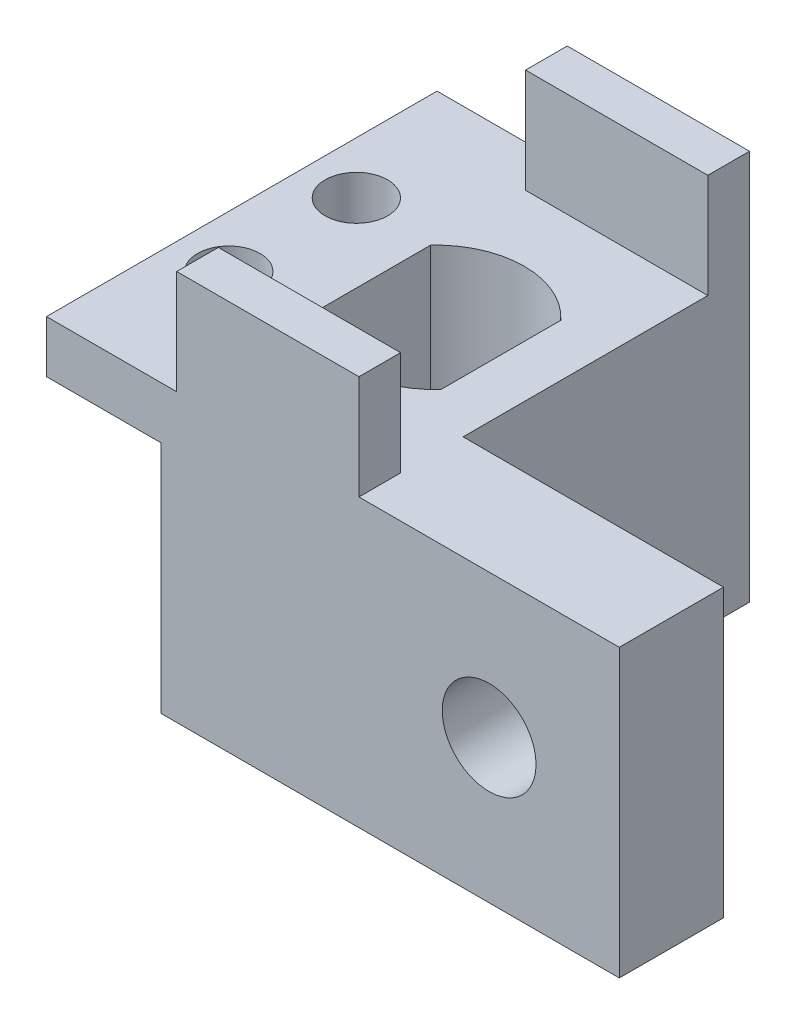
ISO-10303-21;
HEADER;
FILE_DESCRIPTION(('STEP AP214'),'2;1');
FILE_NAME('part.step','',(''),(''),'','','');
FILE_SCHEMA(('AUTOMOTIVE_DESIGN { 1 0 10303 214 1 1 1 1 }'));
ENDSEC;
DATA;
#1=APPLICATION_CONTEXT('core data for automotive mechanical design processes');
#2=APPLICATION_PROTOCOL_DEFINITION('international standard','automotive_design',2000,#1);
#3=PRODUCT_CONTEXT('',#1,'mechanical');
#4=PRODUCT('Part','Part','',(#3));
#5=PRODUCT_RELATED_PRODUCT_CATEGORY('part','',(#4));
#6=PRODUCT_DEFINITION_FORMATION('','',#4);
#7=PRODUCT_DEFINITION_CONTEXT('part definition',#1,'design');
#8=PRODUCT_DEFINITION('design','',#6,#7);
#9=PRODUCT_DEFINITION_SHAPE('','',#8);
#10=(LENGTH_UNIT() NAMED_UNIT(*) SI_UNIT(.MILLI.,.METRE.));
#11=(NAMED_UNIT(*) PLANE_ANGLE_UNIT() SI_UNIT($,.RADIAN.));
#12=(NAMED_UNIT(*) SI_UNIT($,.STERADIAN.) SOLID_ANGLE_UNIT());
#13=UNCERTAINTY_MEASURE_WITH_UNIT(LENGTH_MEASURE(1.E-05),#10,'distance_accuracy_value','');
#14=(GEOMETRIC_REPRESENTATION_CONTEXT(3) GLOBAL_UNCERTAINTY_ASSIGNED_CONTEXT((#13)) GLOBAL_UNIT_ASSIGNED_CONTEXT((#10,
#11,#12)) REPRESENTATION_CONTEXT('',''));
#15=CARTESIAN_POINT('',(0.,0.,0.));
#16=DIRECTION('',(0.,0.,1.));
#17=DIRECTION('',(1.,0.,0.));
#18=AXIS2_PLACEMENT_3D('',#15,#16,#17);
#19=CARTESIAN_POINT('',(0.,0.,0.));
#20=DIRECTION('',(0.,1.,0.));
#21=DIRECTION('',(0.,0.,1.));
#22=AXIS2_PLACEMENT_3D('',#19,#20,#21);
#23=PLANE('',#22);
#24=CARTESIAN_POINT('',(-12.7,0.,-1.26999999999999));
#25=DIRECTION('',(0.,1.,0.));
#26=DIRECTION('',(0.,0.,1.));
#27=AXIS2_PLACEMENT_3D('',#24,#25,#26);
#28=CIRCLE('',#27,1.524);
#29=CARTESIAN_POINT('',(-12.7,0.,0.254000000000005));
#30=VERTEX_POINT('',#29);
#31=EDGE_CURVE('E313',#30,#30,#28,.T.);
#32=ORIENTED_EDGE('',*,*,#31,.T.);
#33=EDGE_LOOP('',(#32));
#34=FACE_BOUND('',#33,.T.);
#35=CARTESIAN_POINT('',(-12.7,0.,-7.49299999999999));
#36=DIRECTION('',(0.,1.,0.));
#37=DIRECTION('',(0.,0.,-1.));
#38=AXIS2_PLACEMENT_3D('',#35,#36,#37);
#39=CIRCLE('',#38,1.524);
#40=CARTESIAN_POINT('',(-12.7,0.,-9.01699999999999));
#41=VERTEX_POINT('',#40);
#42=EDGE_CURVE('E321',#41,#41,#39,.T.);
#43=ORIENTED_EDGE('',*,*,#42,.T.);
#44=EDGE_LOOP('',(#43));
#45=FACE_BOUND('',#44,.T.);
#46=DIRECTION('',(0.,0.,-1.));
#47=VECTOR('',#46,1.);
#48=CARTESIAN_POINT('',(-9.652,0.,5.08));
#49=LINE('',#48,#47);
#50=CARTESIAN_POINT('',(-9.652,0.,5.08));
#51=VERTEX_POINT('',#50);
#52=CARTESIAN_POINT('',(-9.652,0.,-13.97));
#53=VERTEX_POINT('',#52);
#54=EDGE_CURVE('E196',#51,#53,#49,.T.);
#55=ORIENTED_EDGE('',*,*,#54,.F.);
#56=DIRECTION('',(1.,0.,0.));
#57=VECTOR('',#56,1.);
#58=CARTESIAN_POINT('',(12.7,0.,5.08));
#59=LINE('',#58,#57);
#60=CARTESIAN_POINT('',(-15.24,0.,5.08));
#61=VERTEX_POINT('',#60);
#62=EDGE_CURVE('E353',#61,#51,#59,.T.);
#63=ORIENTED_EDGE('',*,*,#62,.F.);
#64=DIRECTION('',(0.,0.,1.));
#65=VECTOR('',#64,1.);
#66=CARTESIAN_POINT('',(-15.24,0.,5.08));
#67=LINE('',#66,#65);
#68=CARTESIAN_POINT('',(-15.24,0.,-13.97));
#69=VERTEX_POINT('',#68);
#70=EDGE_CURVE('E372',#69,#61,#67,.T.);
#71=ORIENTED_EDGE('',*,*,#70,.F.);
#72=DIRECTION('',(-1.,0.,0.));
#73=VECTOR('',#72,1.);
#74=CARTESIAN_POINT('',(-15.24,0.,-13.97));
#75=LINE('',#74,#73);
#76=EDGE_CURVE('E343',#53,#69,#75,.T.);
#77=ORIENTED_EDGE('',*,*,#76,.F.);
#78=EDGE_LOOP('',(#55,#63,#71,#77));
#79=FACE_BOUND('',#78,.T.);
#80=ADVANCED_FACE('F39',(#34,#45,#79),#23,.F.);
#81=CARTESIAN_POINT('',(0.,2.54,0.));
#82=DIRECTION('',(0.,1.,0.));
#83=DIRECTION('',(0.,0.,1.));
#84=AXIS2_PLACEMENT_3D('',#81,#82,#83);
#85=PLANE('',#84);
#86=CARTESIAN_POINT('',(-12.7,2.54,-1.26999999999999));
#87=DIRECTION('',(0.,1.,0.));
#88=DIRECTION('',(0.,0.,1.));
#89=AXIS2_PLACEMENT_3D('',#86,#87,#88);
#90=CIRCLE('',#89,1.524);
#91=CARTESIAN_POINT('',(-12.7,2.54,0.254000000000005));
#92=VERTEX_POINT('',#91);
#93=EDGE_CURVE('E317',#92,#92,#90,.T.);
#94=ORIENTED_EDGE('',*,*,#93,.F.);
#95=EDGE_LOOP('',(#94));
#96=FACE_BOUND('',#95,.T.);
#97=CARTESIAN_POINT('',(-12.7,2.54,-7.49299999999999));
#98=DIRECTION('',(0.,1.,0.));
#99=DIRECTION('',(0.,0.,-1.));
#100=AXIS2_PLACEMENT_3D('',#97,#98,#99);
#101=CIRCLE('',#100,1.524);
#102=CARTESIAN_POINT('',(-12.7,2.54,-9.01699999999999));
#103=VERTEX_POINT('',#102);
#104=EDGE_CURVE('E312',#103,#103,#101,.T.);
#105=ORIENTED_EDGE('',*,*,#104,.F.);
#106=EDGE_LOOP('',(#105));
#107=FACE_BOUND('',#106,.T.);
#108=CARTESIAN_POINT('',(-5.715,2.54,-4.38149999999999));
#109=DIRECTION('',(0.,1.,0.));
#110=DIRECTION('',(0.,0.,1.));
#111=AXIS2_PLACEMENT_3D('',#108,#109,#110);
#112=CIRCLE('',#111,4.318);
#113=CARTESIAN_POINT('',(-8.89,2.54,-1.45498347006205));
#114=VERTEX_POINT('',#113);
#115=CARTESIAN_POINT('',(-2.54,2.54,-1.45498347006205));
#116=VERTEX_POINT('',#115);
#117=EDGE_CURVE('E178',#114,#116,#112,.T.);
#118=ORIENTED_EDGE('',*,*,#117,.F.);
#119=DIRECTION('',(0.,0.,-1.));
#120=VECTOR('',#119,1.);
#121=CARTESIAN_POINT('',(-8.89,2.54,-1.45498347006205));
#122=LINE('',#121,#120);
#123=CARTESIAN_POINT('',(-8.89,2.54,-7.30801652993793));
#124=VERTEX_POINT('',#123);
#125=EDGE_CURVE('E181',#114,#124,#122,.T.);
#126=ORIENTED_EDGE('',*,*,#125,.T.);
#127=CARTESIAN_POINT('',(-5.715,2.54,-4.38149999999999));
#128=DIRECTION('',(0.,1.,0.));
#129=DIRECTION('',(0.,0.,1.));
#130=AXIS2_PLACEMENT_3D('',#127,#128,#129);
#131=CIRCLE('',#130,4.318);
#132=CARTESIAN_POINT('',(-2.54,2.54,-7.30801652993793));
#133=VERTEX_POINT('',#132);
#134=EDGE_CURVE('E333',#133,#124,#131,.T.);
#135=ORIENTED_EDGE('',*,*,#134,.F.);
#136=DIRECTION('',(0.,0.,-1.));
#137=VECTOR('',#136,1.);
#138=CARTESIAN_POINT('',(-2.54,2.54,-1.45498347006205));
#139=LINE('',#138,#137);
#140=EDGE_CURVE('E330',#116,#133,#139,.T.);
#141=ORIENTED_EDGE('',*,*,#140,.F.);
#142=EDGE_LOOP('',(#118,#126,#135,#141));
#143=FACE_BOUND('',#142,.T.);
#144=DIRECTION('',(-1.,0.,0.));
#145=VECTOR('',#144,1.);
#146=CARTESIAN_POINT('',(0.,2.54,3.048));
#147=LINE('',#146,#145);
#148=CARTESIAN_POINT('',(0.,2.54,3.048));
#149=VERTEX_POINT('',#148);
#150=CARTESIAN_POINT('',(-8.89,2.54,3.048));
#151=VERTEX_POINT('',#150);
#152=EDGE_CURVE('E63',#149,#151,#147,.T.);
#153=ORIENTED_EDGE('',*,*,#152,.F.);
#154=DIRECTION('',(0.,0.,-1.));
#155=VECTOR('',#154,1.);
#156=CARTESIAN_POINT('',(0.,2.54,5.08));
#157=LINE('',#156,#155);
#158=CARTESIAN_POINT('',(0.,2.54,5.08));
#159=VERTEX_POINT('',#158);
#160=EDGE_CURVE('E241',#159,#149,#157,.T.);
#161=ORIENTED_EDGE('',*,*,#160,.F.);
#162=DIRECTION('',(1.,0.,0.));
#163=VECTOR('',#162,1.);
#164=CARTESIAN_POINT('',(12.7,2.54,5.08));
#165=LINE('',#164,#163);
#166=CARTESIAN_POINT('',(12.7,2.54,5.08));
#167=VERTEX_POINT('',#166);
#168=EDGE_CURVE('E359',#159,#167,#165,.T.);
#169=ORIENTED_EDGE('',*,*,#168,.T.);
#170=DIRECTION('',(0.,0.,-1.));
#171=VECTOR('',#170,1.);
#172=CARTESIAN_POINT('',(12.7,2.54,0.));
#173=LINE('',#172,#171);
#174=CARTESIAN_POINT('',(12.7,2.54,0.));
#175=VERTEX_POINT('',#174);
#176=EDGE_CURVE('E363',#167,#175,#173,.T.);
#177=ORIENTED_EDGE('',*,*,#176,.T.);
#178=DIRECTION('',(-1.,0.,0.));
#179=VECTOR('',#178,1.);
#180=CARTESIAN_POINT('',(0.,2.54,0.));
#181=LINE('',#180,#179);
#182=CARTESIAN_POINT('',(0.,2.54,0.));
#183=VERTEX_POINT('',#182);
#184=EDGE_CURVE('E366',#175,#183,#181,.T.);
#185=ORIENTED_EDGE('',*,*,#184,.T.);
#186=DIRECTION('',(0.,0.,-1.));
#187=VECTOR('',#186,1.);
#188=CARTESIAN_POINT('',(0.,2.54,-13.97));
#189=LINE('',#188,#187);
#190=CARTESIAN_POINT('',(0.,2.54,-11.938));
#191=VERTEX_POINT('',#190);
#192=EDGE_CURVE('E349',#183,#191,#189,.T.);
#193=ORIENTED_EDGE('',*,*,#192,.T.);
#194=DIRECTION('',(1.,0.,0.));
#195=VECTOR('',#194,1.);
#196=CARTESIAN_POINT('',(0.,2.54,-11.938));
#197=LINE('',#196,#195);
#198=CARTESIAN_POINT('',(-8.89,2.54,-11.938));
#199=VERTEX_POINT('',#198);
#200=EDGE_CURVE('E285',#199,#191,#197,.T.);
#201=ORIENTED_EDGE('',*,*,#200,.F.);
#202=DIRECTION('',(0.,0.,1.));
#203=VECTOR('',#202,1.);
#204=CARTESIAN_POINT('',(-8.89,2.54,-13.97));
#205=LINE('',#204,#203);
#206=CARTESIAN_POINT('',(-8.89,2.54,-13.97));
#207=VERTEX_POINT('',#206);
#208=EDGE_CURVE('E279',#207,#199,#205,.T.);
#209=ORIENTED_EDGE('',*,*,#208,.F.);
#210=DIRECTION('',(-1.,0.,0.));
#211=VECTOR('',#210,1.);
#212=CARTESIAN_POINT('',(-15.24,2.54,-13.97));
#213=LINE('',#212,#211);
#214=CARTESIAN_POINT('',(-15.24,2.54,-13.97));
#215=VERTEX_POINT('',#214);
#216=EDGE_CURVE('E352',#207,#215,#213,.T.);
#217=ORIENTED_EDGE('',*,*,#216,.T.);
#218=DIRECTION('',(0.,0.,1.));
#219=VECTOR('',#218,1.);
#220=CARTESIAN_POINT('',(-15.24,2.54,5.08));
#221=LINE('',#220,#219);
#222=CARTESIAN_POINT('',(-15.24,2.54,5.08));
#223=VERTEX_POINT('',#222);
#224=EDGE_CURVE('E356',#215,#223,#221,.T.);
#225=ORIENTED_EDGE('',*,*,#224,.T.);
#226=CARTESIAN_POINT('',(-8.89,2.54,5.08));
#227=VERTEX_POINT('',#226);
#228=EDGE_CURVE('E360',#223,#227,#165,.T.);
#229=ORIENTED_EDGE('',*,*,#228,.T.);
#230=DIRECTION('',(0.,0.,1.));
#231=VECTOR('',#230,1.);
#232=CARTESIAN_POINT('',(-8.89,2.54,5.08));
#233=LINE('',#232,#231);
#234=EDGE_CURVE('E247',#151,#227,#233,.T.);
#235=ORIENTED_EDGE('',*,*,#234,.F.);
#236=EDGE_LOOP('',(#153,#161,#169,#177,#185,#193,#201,#209,#217,#225,#229,#235));
#237=FACE_BOUND('',#236,.T.);
#238=ADVANCED_FACE('F412',(#96,#107,#143,#237),#85,.T.);
#239=CARTESIAN_POINT('',(0.,2.54,-13.97));
#240=DIRECTION('',(-1.,0.,0.));
#241=DIRECTION('',(0.,0.,1.));
#242=AXIS2_PLACEMENT_3D('',#239,#240,#241);
#243=PLANE('',#242);
#244=DIRECTION('',(0.,-1.,0.));
#245=VECTOR('',#244,1.);
#246=CARTESIAN_POINT('',(0.,2.54,0.));
#247=LINE('',#246,#245);
#248=CARTESIAN_POINT('',(0.,-11.43,0.));
#249=VERTEX_POINT('',#248);
#250=EDGE_CURVE('E369',#183,#249,#247,.T.);
#251=ORIENTED_EDGE('',*,*,#250,.T.);
#252=DIRECTION('',(0.,0.,1.));
#253=VECTOR('',#252,1.);
#254=CARTESIAN_POINT('',(0.,-11.43,5.08));
#255=LINE('',#254,#253);
#256=CARTESIAN_POINT('',(0.,-11.43,-13.97));
#257=VERTEX_POINT('',#256);
#258=EDGE_CURVE('E200',#257,#249,#255,.T.);
#259=ORIENTED_EDGE('',*,*,#258,.F.);
#260=DIRECTION('',(0.,-1.,0.));
#261=VECTOR('',#260,1.);
#262=CARTESIAN_POINT('',(0.,2.54,-13.97));
#263=LINE('',#262,#261);
#264=CARTESIAN_POINT('',(0.,7.62,-13.97));
#265=VERTEX_POINT('',#264);
#266=EDGE_CURVE('E11',#265,#257,#263,.T.);
#267=ORIENTED_EDGE('',*,*,#266,.F.);
#268=DIRECTION('',(0.,0.,-1.));
#269=VECTOR('',#268,1.);
#270=CARTESIAN_POINT('',(0.,7.62,-13.97));
#271=LINE('',#270,#269);
#272=CARTESIAN_POINT('',(0.,7.62,-11.938));
#273=VERTEX_POINT('',#272);
#274=EDGE_CURVE('E280',#273,#265,#271,.T.);
#275=ORIENTED_EDGE('',*,*,#274,.F.);
#276=DIRECTION('',(0.,-1.,0.));
#277=VECTOR('',#276,1.);
#278=CARTESIAN_POINT('',(0.,7.62,-11.938));
#279=LINE('',#278,#277);
#280=EDGE_CURVE('E294',#273,#191,#279,.T.);
#281=ORIENTED_EDGE('',*,*,#280,.T.);
#282=ORIENTED_EDGE('',*,*,#192,.F.);
#283=EDGE_LOOP('',(#251,#259,#267,#275,#281,#282));
#284=FACE_BOUND('',#283,.T.);
#285=ADVANCED_FACE('F41',(#284),#243,.F.);
#286=CARTESIAN_POINT('',(-15.24,2.54,-13.97));
#287=DIRECTION('',(0.,0.,1.));
#288=DIRECTION('',(1.,0.,0.));
#289=AXIS2_PLACEMENT_3D('',#286,#287,#288);
#290=PLANE('',#289);
#291=ORIENTED_EDGE('',*,*,#266,.T.);
#292=DIRECTION('',(1.,0.,0.));
#293=VECTOR('',#292,1.);
#294=CARTESIAN_POINT('',(0.,-11.43,-13.97));
#295=LINE('',#294,#293);
#296=CARTESIAN_POINT('',(-9.652,-11.43,-13.97));
#297=VERTEX_POINT('',#296);
#298=EDGE_CURVE('E211',#297,#257,#295,.T.);
#299=ORIENTED_EDGE('',*,*,#298,.F.);
#300=DIRECTION('',(0.,1.,0.));
#301=VECTOR('',#300,1.);
#302=CARTESIAN_POINT('',(-9.652,-11.43,-13.97));
#303=LINE('',#302,#301);
#304=EDGE_CURVE('E214',#297,#53,#303,.T.);
#305=ORIENTED_EDGE('',*,*,#304,.T.);
#306=ORIENTED_EDGE('',*,*,#76,.T.);
#307=DIRECTION('',(0.,-1.,0.));
#308=VECTOR('',#307,1.);
#309=CARTESIAN_POINT('',(-15.24,2.54,-13.97));
#310=LINE('',#309,#308);
#311=EDGE_CURVE('E48',#215,#69,#310,.T.);
#312=ORIENTED_EDGE('',*,*,#311,.F.);
#313=ORIENTED_EDGE('',*,*,#216,.F.);
#314=DIRECTION('',(0.,-1.,0.));
#315=VECTOR('',#314,1.);
#316=CARTESIAN_POINT('',(-8.89,7.62,-13.97));
#317=LINE('',#316,#315);
#318=CARTESIAN_POINT('',(-8.89,7.62,-13.97));
#319=VERTEX_POINT('',#318);
#320=EDGE_CURVE('E308',#319,#207,#317,.T.);
#321=ORIENTED_EDGE('',*,*,#320,.F.);
#322=DIRECTION('',(-1.,0.,0.));
#323=VECTOR('',#322,1.);
#324=CARTESIAN_POINT('',(0.,7.62,-13.97));
#325=LINE('',#324,#323);
#326=EDGE_CURVE('E284',#265,#319,#325,.T.);
#327=ORIENTED_EDGE('',*,*,#326,.F.);
#328=EDGE_LOOP('',(#291,#299,#305,#306,#312,#313,#321,#327));
#329=FACE_BOUND('',#328,.T.);
#330=ADVANCED_FACE('F452',(#329),#290,.F.);
#331=CARTESIAN_POINT('',(-15.24,2.54,5.08));
#332=DIRECTION('',(1.,0.,0.));
#333=DIRECTION('',(0.,0.,-1.));
#334=AXIS2_PLACEMENT_3D('',#331,#332,#333);
#335=PLANE('',#334);
#336=ORIENTED_EDGE('',*,*,#70,.T.);
#337=DIRECTION('',(0.,-1.,0.));
#338=VECTOR('',#337,1.);
#339=CARTESIAN_POINT('',(-15.24,2.54,5.08));
#340=LINE('',#339,#338);
#341=EDGE_CURVE('E386',#223,#61,#340,.T.);
#342=ORIENTED_EDGE('',*,*,#341,.F.);
#343=ORIENTED_EDGE('',*,*,#224,.F.);
#344=ORIENTED_EDGE('',*,*,#311,.T.);
#345=EDGE_LOOP('',(#336,#342,#343,#344));
#346=FACE_BOUND('',#345,.T.);
#347=ADVANCED_FACE('F395',(#346),#335,.F.);
#348=CARTESIAN_POINT('',(12.7,2.54,5.08));
#349=DIRECTION('',(0.,0.,-1.));
#350=DIRECTION('',(-1.,0.,0.));
#351=AXIS2_PLACEMENT_3D('',#348,#349,#350);
#352=PLANE('',#351);
#353=ORIENTED_EDGE('',*,*,#62,.T.);
#354=DIRECTION('',(0.,1.,0.));
#355=VECTOR('',#354,1.);
#356=CARTESIAN_POINT('',(-9.652,-11.43,5.08));
#357=LINE('',#356,#355);
#358=CARTESIAN_POINT('',(-9.652,-11.43,5.08));
#359=VERTEX_POINT('',#358);
#360=EDGE_CURVE('E219',#359,#51,#357,.T.);
#361=ORIENTED_EDGE('',*,*,#360,.F.);
#362=DIRECTION('',(-1.,0.,0.));
#363=VECTOR('',#362,1.);
#364=CARTESIAN_POINT('',(12.7,-11.43,5.08));
#365=LINE('',#364,#363);
#366=CARTESIAN_POINT('',(12.7,-11.43,5.08));
#367=VERTEX_POINT('',#366);
#368=EDGE_CURVE('E234',#367,#359,#365,.T.);
#369=ORIENTED_EDGE('',*,*,#368,.F.);
#370=DIRECTION('',(0.,-1.,0.));
#371=VECTOR('',#370,1.);
#372=CARTESIAN_POINT('',(12.7,2.54,5.08));
#373=LINE('',#372,#371);
#374=EDGE_CURVE('E383',#167,#367,#373,.T.);
#375=ORIENTED_EDGE('',*,*,#374,.F.);
#376=ORIENTED_EDGE('',*,*,#168,.F.);
#377=DIRECTION('',(0.,-1.,0.));
#378=VECTOR('',#377,1.);
#379=CARTESIAN_POINT('',(0.,7.62,5.08));
#380=LINE('',#379,#378);
#381=CARTESIAN_POINT('',(0.,7.62,5.08));
#382=VERTEX_POINT('',#381);
#383=EDGE_CURVE('E256',#382,#159,#380,.T.);
#384=ORIENTED_EDGE('',*,*,#383,.F.);
#385=DIRECTION('',(1.,0.,0.));
#386=VECTOR('',#385,1.);
#387=CARTESIAN_POINT('',(0.,7.62,5.08));
#388=LINE('',#387,#386);
#389=CARTESIAN_POINT('',(-8.89,7.62,5.08));
#390=VERTEX_POINT('',#389);
#391=EDGE_CURVE('E253',#390,#382,#388,.T.);
#392=ORIENTED_EDGE('',*,*,#391,.F.);
#393=DIRECTION('',(0.,-1.,0.));
#394=VECTOR('',#393,1.);
#395=CARTESIAN_POINT('',(-8.89,7.62,5.08));
#396=LINE('',#395,#394);
#397=EDGE_CURVE('E268',#390,#227,#396,.T.);
#398=ORIENTED_EDGE('',*,*,#397,.T.);
#399=ORIENTED_EDGE('',*,*,#228,.F.);
#400=ORIENTED_EDGE('',*,*,#341,.T.);
#401=EDGE_LOOP('',(#353,#361,#369,#375,#376,#384,#392,#398,#399,#400));
#402=FACE_BOUND('',#401,.T.);
#403=CARTESIAN_POINT('',(6.35,-4.445,5.08));
#404=DIRECTION('',(0.,0.,-1.));
#405=DIRECTION('',(-1.,0.,0.));
#406=AXIS2_PLACEMENT_3D('',#403,#404,#405);
#407=CIRCLE('',#406,2.286);
#408=CARTESIAN_POINT('',(4.064,-4.445,5.08));
#409=VERTEX_POINT('',#408);
#410=EDGE_CURVE('E226',#409,#409,#407,.T.);
#411=ORIENTED_EDGE('',*,*,#410,.T.);
#412=EDGE_LOOP('',(#411));
#413=FACE_BOUND('',#412,.T.);
#414=ADVANCED_FACE('F405',(#402,#413),#352,.F.);
#415=CARTESIAN_POINT('',(12.7,2.54,0.));
#416=DIRECTION('',(-1.,0.,0.));
#417=DIRECTION('',(0.,0.,1.));
#418=AXIS2_PLACEMENT_3D('',#415,#416,#417);
#419=PLANE('',#418);
#420=ORIENTED_EDGE('',*,*,#374,.T.);
#421=DIRECTION('',(0.,0.,1.));
#422=VECTOR('',#421,1.);
#423=CARTESIAN_POINT('',(12.7,-11.43,5.08));
#424=LINE('',#423,#422);
#425=CARTESIAN_POINT('',(12.7,-11.43,0.));
#426=VERTEX_POINT('',#425);
#427=EDGE_CURVE('E230',#426,#367,#424,.T.);
#428=ORIENTED_EDGE('',*,*,#427,.F.);
#429=DIRECTION('',(0.,-1.,0.));
#430=VECTOR('',#429,1.);
#431=CARTESIAN_POINT('',(12.7,2.54,0.));
#432=LINE('',#431,#430);
#433=EDGE_CURVE('E380',#175,#426,#432,.T.);
#434=ORIENTED_EDGE('',*,*,#433,.F.);
#435=ORIENTED_EDGE('',*,*,#176,.F.);
#436=EDGE_LOOP('',(#420,#428,#434,#435));
#437=FACE_BOUND('',#436,.T.);
#438=ADVANCED_FACE('F430',(#437),#419,.F.);
#439=CARTESIAN_POINT('',(0.,2.54,0.));
#440=DIRECTION('',(0.,0.,1.));
#441=DIRECTION('',(1.,0.,0.));
#442=AXIS2_PLACEMENT_3D('',#439,#440,#441);
#443=PLANE('',#442);
#444=CARTESIAN_POINT('',(6.35,-4.445,0.));
#445=DIRECTION('',(0.,0.,-1.));
#446=DIRECTION('',(-1.,0.,0.));
#447=AXIS2_PLACEMENT_3D('',#444,#445,#446);
#448=CIRCLE('',#447,2.286);
#449=CARTESIAN_POINT('',(4.064,-4.445,0.));
#450=VERTEX_POINT('',#449);
#451=EDGE_CURVE('E222',#450,#450,#448,.T.);
#452=ORIENTED_EDGE('',*,*,#451,.F.);
#453=EDGE_LOOP('',(#452));
#454=FACE_BOUND('',#453,.T.);
#455=ORIENTED_EDGE('',*,*,#433,.T.);
#456=DIRECTION('',(1.,0.,0.));
#457=VECTOR('',#456,1.);
#458=CARTESIAN_POINT('',(12.7,-11.43,0.));
#459=LINE('',#458,#457);
#460=EDGE_CURVE('E237',#249,#426,#459,.T.);
#461=ORIENTED_EDGE('',*,*,#460,.F.);
#462=ORIENTED_EDGE('',*,*,#250,.F.);
#463=ORIENTED_EDGE('',*,*,#184,.F.);
#464=EDGE_LOOP('',(#455,#461,#462,#463));
#465=FACE_BOUND('',#464,.T.);
#466=ADVANCED_FACE('F435',(#454,#465),#443,.F.);
#467=CARTESIAN_POINT('',(-5.715,-21.336,-4.38149999999999));
#468=DIRECTION('',(0.,1.,0.));
#469=DIRECTION('',(0.,0.,1.));
#470=AXIS2_PLACEMENT_3D('',#467,#468,#469);
#471=CYLINDRICAL_SURFACE('',#470,4.318);
#472=DIRECTION('',(0.,1.,0.));
#473=VECTOR('',#472,1.);
#474=CARTESIAN_POINT('',(-8.89,-21.336,-1.45498347006205));
#475=LINE('',#474,#473);
#476=CARTESIAN_POINT('',(-8.89,-11.43,-1.45498347006205));
#477=VERTEX_POINT('',#476);
#478=EDGE_CURVE('E340',#477,#114,#475,.T.);
#479=ORIENTED_EDGE('',*,*,#478,.T.);
#480=ORIENTED_EDGE('',*,*,#117,.T.);
#481=DIRECTION('',(0.,1.,0.));
#482=VECTOR('',#481,1.);
#483=CARTESIAN_POINT('',(-2.54,-21.336,-1.45498347006205));
#484=LINE('',#483,#482);
#485=CARTESIAN_POINT('',(-2.54,-11.43,-1.45498347006205));
#486=VERTEX_POINT('',#485);
#487=EDGE_CURVE('E172',#486,#116,#484,.T.);
#488=ORIENTED_EDGE('',*,*,#487,.F.);
#489=CARTESIAN_POINT('',(-5.715,-11.43,-4.38149999999999));
#490=DIRECTION('',(0.,1.,0.));
#491=DIRECTION('',(0.,0.,1.));
#492=AXIS2_PLACEMENT_3D('',#489,#490,#491);
#493=CIRCLE('',#492,4.318);
#494=EDGE_CURVE('E175',#477,#486,#493,.T.);
#495=ORIENTED_EDGE('',*,*,#494,.F.);
#496=EDGE_LOOP('',(#479,#480,#488,#495));
#497=FACE_BOUND('',#496,.T.);
#498=ADVANCED_FACE('F173',(#497),#471,.F.);
#499=CARTESIAN_POINT('',(-8.89,-21.336,-1.45498347006205));
#500=DIRECTION('',(1.,0.,0.));
#501=DIRECTION('',(0.,0.,-1.));
#502=AXIS2_PLACEMENT_3D('',#499,#500,#501);
#503=PLANE('',#502);
#504=ORIENTED_EDGE('',*,*,#478,.F.);
#505=DIRECTION('',(0.,0.,1.));
#506=VECTOR('',#505,1.);
#507=CARTESIAN_POINT('',(-8.89,-11.43,0.));
#508=LINE('',#507,#506);
#509=CARTESIAN_POINT('',(-8.89,-11.43,-7.30801652993793));
#510=VERTEX_POINT('',#509);
#511=EDGE_CURVE('E194',#510,#477,#508,.T.);
#512=ORIENTED_EDGE('',*,*,#511,.F.);
#513=DIRECTION('',(0.,1.,0.));
#514=VECTOR('',#513,1.);
#515=CARTESIAN_POINT('',(-8.89,-21.336,-7.30801652993793));
#516=LINE('',#515,#514);
#517=EDGE_CURVE('E344',#510,#124,#516,.T.);
#518=ORIENTED_EDGE('',*,*,#517,.T.);
#519=ORIENTED_EDGE('',*,*,#125,.F.);
#520=EDGE_LOOP('',(#504,#512,#518,#519));
#521=FACE_BOUND('',#520,.T.);
#522=ADVANCED_FACE('F626',(#521),#503,.T.);
#523=CARTESIAN_POINT('',(-5.715,-21.336,-4.38149999999999));
#524=DIRECTION('',(0.,1.,0.));
#525=DIRECTION('',(0.,0.,1.));
#526=AXIS2_PLACEMENT_3D('',#523,#524,#525);
#527=CYLINDRICAL_SURFACE('',#526,4.318);
#528=DIRECTION('',(0.,1.,0.));
#529=VECTOR('',#528,1.);
#530=CARTESIAN_POINT('',(-2.54,-21.336,-7.30801652993793));
#531=LINE('',#530,#529);
#532=CARTESIAN_POINT('',(-2.54,-11.43,-7.30801652993793));
#533=VERTEX_POINT('',#532);
#534=EDGE_CURVE('E55',#533,#133,#531,.T.);
#535=ORIENTED_EDGE('',*,*,#534,.T.);
#536=ORIENTED_EDGE('',*,*,#134,.T.);
#537=ORIENTED_EDGE('',*,*,#517,.F.);
#538=CARTESIAN_POINT('',(-5.715,-11.43,-4.38149999999999));
#539=DIRECTION('',(0.,1.,0.));
#540=DIRECTION('',(0.,0.,1.));
#541=AXIS2_PLACEMENT_3D('',#538,#539,#540);
#542=CIRCLE('',#541,4.318);
#543=EDGE_CURVE('E189',#533,#510,#542,.T.);
#544=ORIENTED_EDGE('',*,*,#543,.F.);
#545=EDGE_LOOP('',(#535,#536,#537,#544));
#546=FACE_BOUND('',#545,.T.);
#547=ADVANCED_FACE('F637',(#546),#527,.F.);
#548=CARTESIAN_POINT('',(-2.54,-21.336,-1.45498347006205));
#549=DIRECTION('',(1.,0.,0.));
#550=DIRECTION('',(0.,0.,-1.));
#551=AXIS2_PLACEMENT_3D('',#548,#549,#550);
#552=PLANE('',#551);
#553=ORIENTED_EDGE('',*,*,#487,.T.);
#554=ORIENTED_EDGE('',*,*,#140,.T.);
#555=ORIENTED_EDGE('',*,*,#534,.F.);
#556=DIRECTION('',(0.,0.,-1.));
#557=VECTOR('',#556,1.);
#558=CARTESIAN_POINT('',(-2.54,-11.43,0.));
#559=LINE('',#558,#557);
#560=EDGE_CURVE('E184',#486,#533,#559,.T.);
#561=ORIENTED_EDGE('',*,*,#560,.F.);
#562=EDGE_LOOP('',(#553,#554,#555,#561));
#563=FACE_BOUND('',#562,.T.);
#564=ADVANCED_FACE('F185',(#563),#552,.F.);
#565=CARTESIAN_POINT('',(-12.7,0.,-7.49299999999999));
#566=DIRECTION('',(0.,1.,0.));
#567=DIRECTION('',(0.,0.,1.));
#568=AXIS2_PLACEMENT_3D('',#565,#566,#567);
#569=CYLINDRICAL_SURFACE('',#568,1.524);
#570=ORIENTED_EDGE('',*,*,#42,.F.);
#571=EDGE_LOOP('',(#570));
#572=FACE_BOUND('',#571,.T.);
#573=ORIENTED_EDGE('',*,*,#104,.T.);
#574=EDGE_LOOP('',(#573));
#575=FACE_BOUND('',#574,.T.);
#576=ADVANCED_FACE('F658',(#572,#575),#569,.F.);
#577=CARTESIAN_POINT('',(-12.7,0.,-1.26999999999999));
#578=DIRECTION('',(0.,1.,0.));
#579=DIRECTION('',(0.,0.,1.));
#580=AXIS2_PLACEMENT_3D('',#577,#578,#579);
#581=CYLINDRICAL_SURFACE('',#580,1.524);
#582=ORIENTED_EDGE('',*,*,#31,.F.);
#583=EDGE_LOOP('',(#582));
#584=FACE_BOUND('',#583,.T.);
#585=ORIENTED_EDGE('',*,*,#93,.T.);
#586=EDGE_LOOP('',(#585));
#587=FACE_BOUND('',#586,.T.);
#588=ADVANCED_FACE('F502',(#584,#587),#581,.F.);
#589=CARTESIAN_POINT('',(-8.89,7.62,-13.97));
#590=DIRECTION('',(1.,0.,0.));
#591=DIRECTION('',(0.,0.,-1.));
#592=AXIS2_PLACEMENT_3D('',#589,#590,#591);
#593=PLANE('',#592);
#594=ORIENTED_EDGE('',*,*,#208,.T.);
#595=DIRECTION('',(0.,-1.,0.));
#596=VECTOR('',#595,1.);
#597=CARTESIAN_POINT('',(-8.89,7.62,-11.938));
#598=LINE('',#597,#596);
#599=CARTESIAN_POINT('',(-8.89,7.62,-11.938));
#600=VERTEX_POINT('',#599);
#601=EDGE_CURVE('E304',#600,#199,#598,.T.);
#602=ORIENTED_EDGE('',*,*,#601,.F.);
#603=DIRECTION('',(0.,0.,1.));
#604=VECTOR('',#603,1.);
#605=CARTESIAN_POINT('',(-8.89,7.62,-13.97));
#606=LINE('',#605,#604);
#607=EDGE_CURVE('E288',#319,#600,#606,.T.);
#608=ORIENTED_EDGE('',*,*,#607,.F.);
#609=ORIENTED_EDGE('',*,*,#320,.T.);
#610=EDGE_LOOP('',(#594,#602,#608,#609));
#611=FACE_BOUND('',#610,.T.);
#612=ADVANCED_FACE('F451',(#611),#593,.F.);
#613=CARTESIAN_POINT('',(0.,7.62,-11.938));
#614=DIRECTION('',(0.,0.,-1.));
#615=DIRECTION('',(-1.,0.,0.));
#616=AXIS2_PLACEMENT_3D('',#613,#614,#615);
#617=PLANE('',#616);
#618=ORIENTED_EDGE('',*,*,#200,.T.);
#619=ORIENTED_EDGE('',*,*,#280,.F.);
#620=DIRECTION('',(1.,0.,0.));
#621=VECTOR('',#620,1.);
#622=CARTESIAN_POINT('',(0.,7.62,-11.938));
#623=LINE('',#622,#621);
#624=EDGE_CURVE('E291',#600,#273,#623,.T.);
#625=ORIENTED_EDGE('',*,*,#624,.F.);
#626=ORIENTED_EDGE('',*,*,#601,.T.);
#627=EDGE_LOOP('',(#618,#619,#625,#626));
#628=FACE_BOUND('',#627,.T.);
#629=ADVANCED_FACE('F440',(#628),#617,.F.);
#630=CARTESIAN_POINT('',(0.,7.62,0.));
#631=DIRECTION('',(0.,-1.,0.));
#632=DIRECTION('',(0.,0.,-1.));
#633=AXIS2_PLACEMENT_3D('',#630,#631,#632);
#634=PLANE('',#633);
#635=ORIENTED_EDGE('',*,*,#274,.T.);
#636=ORIENTED_EDGE('',*,*,#326,.T.);
#637=ORIENTED_EDGE('',*,*,#607,.T.);
#638=ORIENTED_EDGE('',*,*,#624,.T.);
#639=EDGE_LOOP('',(#635,#636,#637,#638));
#640=FACE_BOUND('',#639,.T.);
#641=ADVANCED_FACE('F447',(#640),#634,.F.);
#642=CARTESIAN_POINT('',(0.,7.62,5.08));
#643=DIRECTION('',(-1.,0.,0.));
#644=DIRECTION('',(0.,0.,1.));
#645=AXIS2_PLACEMENT_3D('',#642,#643,#644);
#646=PLANE('',#645);
#647=ORIENTED_EDGE('',*,*,#160,.T.);
#648=DIRECTION('',(0.,-1.,0.));
#649=VECTOR('',#648,1.);
#650=CARTESIAN_POINT('',(0.,7.62,3.048));
#651=LINE('',#650,#649);
#652=CARTESIAN_POINT('',(0.,7.62,3.048));
#653=VERTEX_POINT('',#652);
#654=EDGE_CURVE('E276',#653,#149,#651,.T.);
#655=ORIENTED_EDGE('',*,*,#654,.F.);
#656=DIRECTION('',(0.,0.,-1.));
#657=VECTOR('',#656,1.);
#658=CARTESIAN_POINT('',(0.,7.62,5.08));
#659=LINE('',#658,#657);
#660=EDGE_CURVE('E242',#382,#653,#659,.T.);
#661=ORIENTED_EDGE('',*,*,#660,.F.);
#662=ORIENTED_EDGE('',*,*,#383,.T.);
#663=EDGE_LOOP('',(#647,#655,#661,#662));
#664=FACE_BOUND('',#663,.T.);
#665=ADVANCED_FACE('F422',(#664),#646,.F.);
#666=CARTESIAN_POINT('',(0.,7.62,3.048));
#667=DIRECTION('',(0.,0.,1.));
#668=DIRECTION('',(1.,0.,0.));
#669=AXIS2_PLACEMENT_3D('',#666,#667,#668);
#670=PLANE('',#669);
#671=ORIENTED_EDGE('',*,*,#152,.T.);
#672=DIRECTION('',(0.,-1.,0.));
#673=VECTOR('',#672,1.);
#674=CARTESIAN_POINT('',(-8.89,7.62,3.048));
#675=LINE('',#674,#673);
#676=CARTESIAN_POINT('',(-8.89,7.62,3.048));
#677=VERTEX_POINT('',#676);
#678=EDGE_CURVE('E272',#677,#151,#675,.T.);
#679=ORIENTED_EDGE('',*,*,#678,.F.);
#680=DIRECTION('',(-1.,0.,0.));
#681=VECTOR('',#680,1.);
#682=CARTESIAN_POINT('',(0.,7.62,3.048));
#683=LINE('',#682,#681);
#684=EDGE_CURVE('E246',#653,#677,#683,.T.);
#685=ORIENTED_EDGE('',*,*,#684,.F.);
#686=ORIENTED_EDGE('',*,*,#654,.T.);
#687=EDGE_LOOP('',(#671,#679,#685,#686));
#688=FACE_BOUND('',#687,.T.);
#689=ADVANCED_FACE('F418',(#688),#670,.F.);
#690=CARTESIAN_POINT('',(-8.89,7.62,5.08));
#691=DIRECTION('',(1.,0.,0.));
#692=DIRECTION('',(0.,0.,-1.));
#693=AXIS2_PLACEMENT_3D('',#690,#691,#692);
#694=PLANE('',#693);
#695=ORIENTED_EDGE('',*,*,#234,.T.);
#696=ORIENTED_EDGE('',*,*,#397,.F.);
#697=DIRECTION('',(0.,0.,1.));
#698=VECTOR('',#697,1.);
#699=CARTESIAN_POINT('',(-8.89,7.62,5.08));
#700=LINE('',#699,#698);
#701=EDGE_CURVE('E250',#677,#390,#700,.T.);
#702=ORIENTED_EDGE('',*,*,#701,.F.);
#703=ORIENTED_EDGE('',*,*,#678,.T.);
#704=EDGE_LOOP('',(#695,#696,#702,#703));
#705=FACE_BOUND('',#704,.T.);
#706=ADVANCED_FACE('F414',(#705),#694,.F.);
#707=CARTESIAN_POINT('',(0.,7.62,0.));
#708=DIRECTION('',(0.,1.,0.));
#709=DIRECTION('',(0.,0.,1.));
#710=AXIS2_PLACEMENT_3D('',#707,#708,#709);
#711=PLANE('',#710);
#712=ORIENTED_EDGE('',*,*,#660,.T.);
#713=ORIENTED_EDGE('',*,*,#684,.T.);
#714=ORIENTED_EDGE('',*,*,#701,.T.);
#715=ORIENTED_EDGE('',*,*,#391,.T.);
#716=EDGE_LOOP('',(#712,#713,#714,#715));
#717=FACE_BOUND('',#716,.T.);
#718=ADVANCED_FACE('F551',(#717),#711,.T.);
#719=CARTESIAN_POINT('',(0.,-11.43,0.));
#720=DIRECTION('',(0.,1.,0.));
#721=DIRECTION('',(0.,0.,1.));
#722=AXIS2_PLACEMENT_3D('',#719,#720,#721);
#723=PLANE('',#722);
#724=ORIENTED_EDGE('',*,*,#511,.T.);
#725=ORIENTED_EDGE('',*,*,#494,.T.);
#726=ORIENTED_EDGE('',*,*,#560,.T.);
#727=ORIENTED_EDGE('',*,*,#543,.T.);
#728=EDGE_LOOP('',(#724,#725,#726,#727));
#729=FACE_BOUND('',#728,.T.);
#730=ORIENTED_EDGE('',*,*,#427,.T.);
#731=ORIENTED_EDGE('',*,*,#368,.T.);
#732=DIRECTION('',(0.,0.,-1.));
#733=VECTOR('',#732,1.);
#734=CARTESIAN_POINT('',(-9.652,-11.43,5.08));
#735=LINE('',#734,#733);
#736=EDGE_CURVE('E208',#359,#297,#735,.T.);
#737=ORIENTED_EDGE('',*,*,#736,.T.);
#738=ORIENTED_EDGE('',*,*,#298,.T.);
#739=ORIENTED_EDGE('',*,*,#258,.T.);
#740=ORIENTED_EDGE('',*,*,#460,.T.);
#741=EDGE_LOOP('',(#730,#731,#737,#738,#739,#740));
#742=FACE_BOUND('',#741,.T.);
#743=ADVANCED_FACE('F191',(#729,#742),#723,.F.);
#744=CARTESIAN_POINT('',(6.35,-4.445,11.43));
#745=DIRECTION('',(0.,0.,-1.));
#746=DIRECTION('',(-1.,0.,0.));
#747=AXIS2_PLACEMENT_3D('',#744,#745,#746);
#748=CYLINDRICAL_SURFACE('',#747,2.286);
#749=ORIENTED_EDGE('',*,*,#451,.T.);
#750=EDGE_LOOP('',(#749));
#751=FACE_BOUND('',#750,.T.);
#752=ORIENTED_EDGE('',*,*,#410,.F.);
#753=EDGE_LOOP('',(#752));
#754=FACE_BOUND('',#753,.T.);
#755=ADVANCED_FACE('F458',(#751,#754),#748,.F.);
#756=CARTESIAN_POINT('',(-9.652,-11.43,5.08));
#757=DIRECTION('',(1.,0.,0.));
#758=DIRECTION('',(0.,0.,-1.));
#759=AXIS2_PLACEMENT_3D('',#756,#757,#758);
#760=PLANE('',#759);
#761=ORIENTED_EDGE('',*,*,#54,.T.);
#762=ORIENTED_EDGE('',*,*,#304,.F.);
#763=ORIENTED_EDGE('',*,*,#736,.F.);
#764=ORIENTED_EDGE('',*,*,#360,.T.);
#765=EDGE_LOOP('',(#761,#762,#763,#764));
#766=FACE_BOUND('',#765,.T.);
#767=ADVANCED_FACE('F456',(#766),#760,.F.);
#768=CLOSED_SHELL('',(#80,#238,#285,#330,#347,#414,#438,#466,#498,#522,#547,#564,#576,#588,#612,
#629,#641,#665,#689,#706,#718,#743,#755,#767));
#769=MANIFOLD_SOLID_BREP('B2',#768);
#770=ADVANCED_BREP_SHAPE_REPRESENTATION('',(#18,#769),#14);
#771=SHAPE_DEFINITION_REPRESENTATION(#9,#770);
ENDSEC;
END-ISO-10303-21;
